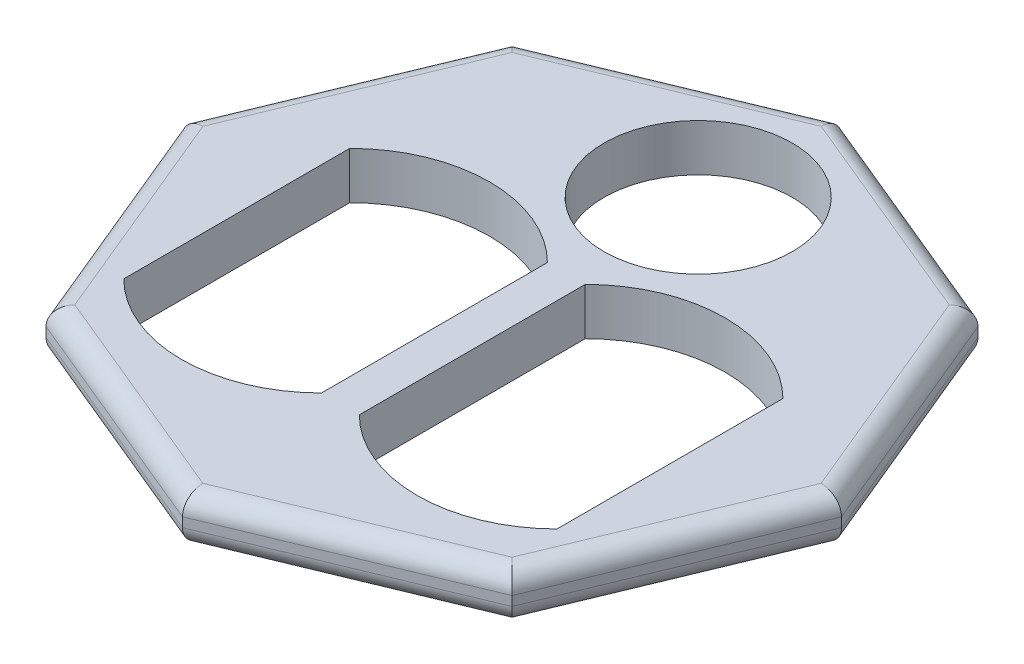
ISO-10303-21;
HEADER;
FILE_DESCRIPTION(('STEP AP214'),'2;1');
FILE_NAME('part.step','',(''),(''),'','','');
FILE_SCHEMA(('AUTOMOTIVE_DESIGN { 1 0 10303 214 1 1 1 1 }'));
ENDSEC;
DATA;
#1=APPLICATION_CONTEXT('core data for automotive mechanical design processes');
#2=APPLICATION_PROTOCOL_DEFINITION('international standard','automotive_design',2000,#1);
#3=PRODUCT_CONTEXT('',#1,'mechanical');
#4=PRODUCT('Part','Part','',(#3));
#5=PRODUCT_RELATED_PRODUCT_CATEGORY('part','',(#4));
#6=PRODUCT_DEFINITION_FORMATION('','',#4);
#7=PRODUCT_DEFINITION_CONTEXT('part definition',#1,'design');
#8=PRODUCT_DEFINITION('design','',#6,#7);
#9=PRODUCT_DEFINITION_SHAPE('','',#8);
#10=(LENGTH_UNIT() NAMED_UNIT(*) SI_UNIT(.MILLI.,.METRE.));
#11=(NAMED_UNIT(*) PLANE_ANGLE_UNIT() SI_UNIT($,.RADIAN.));
#12=(NAMED_UNIT(*) SI_UNIT($,.STERADIAN.) SOLID_ANGLE_UNIT());
#13=UNCERTAINTY_MEASURE_WITH_UNIT(LENGTH_MEASURE(1.E-05),#10,'distance_accuracy_value','');
#14=(GEOMETRIC_REPRESENTATION_CONTEXT(3) GLOBAL_UNCERTAINTY_ASSIGNED_CONTEXT((#13)) GLOBAL_UNIT_ASSIGNED_CONTEXT((#10,
#11,#12)) REPRESENTATION_CONTEXT('',''));
#15=CARTESIAN_POINT('',(0.,0.,0.));
#16=DIRECTION('',(0.,0.,1.));
#17=DIRECTION('',(1.,0.,0.));
#18=AXIS2_PLACEMENT_3D('',#15,#16,#17);
#19=CARTESIAN_POINT('',(0.,5.,0.));
#20=DIRECTION('',(0.,1.,0.));
#21=DIRECTION('',(0.,0.,1.));
#22=AXIS2_PLACEMENT_3D('',#19,#20,#21);
#23=PLANE('',#22);
#24=DIRECTION('',(0.382683432365079,0.,0.923879532511291));
#25=VECTOR('',#24,1.);
#26=CARTESIAN_POINT('',(22.9009782765069,5.,-23.9833704767987));
#27=LINE('',#26,#25);
#28=CARTESIAN_POINT('',(32.8352155994152,5.,3.77901634444324E-13));
#29=VERTEX_POINT('',#28);
#30=CARTESIAN_POINT('',(23.2180036120691,5.,-23.2180036120685));
#31=VERTEX_POINT('',#30);
#32=EDGE_CURVE('E327',#29,#31,#27,.F.);
#33=ORIENTED_EDGE('',*,*,#32,.T.);
#34=DIRECTION('',(0.923879532511282,0.,0.3826834323651));
#35=VECTOR('',#34,1.);
#36=CARTESIAN_POINT('',(-0.765366864729747,5.,-33.1522409349774));
#37=LINE('',#36,#35);
#38=CARTESIAN_POINT('',(0.,5.,-32.8352155994154));
#39=VERTEX_POINT('',#38);
#40=EDGE_CURVE('E329',#31,#39,#37,.F.);
#41=ORIENTED_EDGE('',*,*,#40,.T.);
#42=DIRECTION('',(-0.923879532511282,0.,0.3826834323651));
#43=VECTOR('',#42,1.);
#44=CARTESIAN_POINT('',(-23.9833704767993,5.,-22.9009782765063));
#45=LINE('',#44,#43);
#46=CARTESIAN_POINT('',(-23.2180036120691,5.,-23.2180036120685));
#47=VERTEX_POINT('',#46);
#48=EDGE_CURVE('E315',#39,#47,#45,.T.);
#49=ORIENTED_EDGE('',*,*,#48,.T.);
#50=DIRECTION('',(-0.382683432365079,0.,0.923879532511291));
#51=VECTOR('',#50,1.);
#52=CARTESIAN_POINT('',(-33.1522409349774,5.,0.765366864730565));
#53=LINE('',#52,#51);
#54=CARTESIAN_POINT('',(-32.8352155994152,5.,3.74318697810929E-13));
#55=VERTEX_POINT('',#54);
#56=EDGE_CURVE('E317',#47,#55,#53,.T.);
#57=ORIENTED_EDGE('',*,*,#56,.T.);
#58=DIRECTION('',(0.3826834323651,0.,0.923879532511283));
#59=VECTOR('',#58,1.);
#60=CARTESIAN_POINT('',(-22.9009782765063,5.,23.9833704767993));
#61=LINE('',#60,#59);
#62=CARTESIAN_POINT('',(-23.2180036120685,5.,23.2180036120691));
#63=VERTEX_POINT('',#62);
#64=EDGE_CURVE('E319',#55,#63,#61,.T.);
#65=ORIENTED_EDGE('',*,*,#64,.T.);
#66=DIRECTION('',(0.923879532511291,0.,0.382683432365079));
#67=VECTOR('',#66,1.);
#68=CARTESIAN_POINT('',(0.765366864729876,5.,33.1522409349771));
#69=LINE('',#68,#67);
#70=CARTESIAN_POINT('',(0.,5.,32.8352155994151));
#71=VERTEX_POINT('',#70);
#72=EDGE_CURVE('E321',#63,#71,#69,.T.);
#73=ORIENTED_EDGE('',*,*,#72,.T.);
#74=DIRECTION('',(-0.923879532511291,0.,0.382683432365079));
#75=VECTOR('',#74,1.);
#76=CARTESIAN_POINT('',(23.9833704767987,5.,22.9009782765069));
#77=LINE('',#76,#75);
#78=CARTESIAN_POINT('',(23.2180036120685,5.,23.2180036120691));
#79=VERTEX_POINT('',#78);
#80=EDGE_CURVE('E323',#71,#79,#77,.F.);
#81=ORIENTED_EDGE('',*,*,#80,.T.);
#82=DIRECTION('',(-0.3826834323651,0.,0.923879532511283));
#83=VECTOR('',#82,1.);
#84=CARTESIAN_POINT('',(33.1522409349774,5.,-0.765366864729796));
#85=LINE('',#84,#83);
#86=EDGE_CURVE('E325',#79,#29,#85,.F.);
#87=ORIENTED_EDGE('',*,*,#86,.T.);
#88=EDGE_LOOP('',(#33,#41,#49,#57,#65,#73,#81,#87));
#89=FACE_BOUND('',#88,.T.);
#90=CARTESIAN_POINT('',(0.,5.,-19.772592195674));
#91=DIRECTION('',(0.,1.,0.));
#92=DIRECTION('',(0.,0.,1.));
#93=AXIS2_PLACEMENT_3D('',#90,#91,#92);
#94=CIRCLE('',#93,10.);
#95=CARTESIAN_POINT('',(0.,5.,-9.772592195674));
#96=VERTEX_POINT('',#95);
#97=EDGE_CURVE('E378',#96,#96,#94,.T.);
#98=ORIENTED_EDGE('',*,*,#97,.F.);
#99=EDGE_LOOP('',(#98));
#100=FACE_BOUND('',#99,.T.);
#101=CARTESIAN_POINT('',(-12.50862263104,5.,7.72917563336113));
#102=DIRECTION('',(0.,1.,0.));
#103=DIRECTION('',(0.,0.,1.));
#104=AXIS2_PLACEMENT_3D('',#101,#102,#103);
#105=CIRCLE('',#104,14.8492424049175);
#106=CARTESIAN_POINT('',(-23.00862263104,5.,18.2291756333611));
#107=VERTEX_POINT('',#106);
#108=CARTESIAN_POINT('',(-2.00862263103995,5.,18.2291756333611));
#109=VERTEX_POINT('',#108);
#110=EDGE_CURVE('E247',#107,#109,#105,.T.);
#111=ORIENTED_EDGE('',*,*,#110,.F.);
#112=DIRECTION('',(0.,0.,1.));
#113=VECTOR('',#112,1.);
#114=CARTESIAN_POINT('',(-23.00862263104,5.,-5.77082436663888));
#115=LINE('',#114,#113);
#116=CARTESIAN_POINT('',(-23.00862263104,5.,-5.77082436663888));
#117=VERTEX_POINT('',#116);
#118=EDGE_CURVE('E262',#117,#107,#115,.T.);
#119=ORIENTED_EDGE('',*,*,#118,.F.);
#120=CARTESIAN_POINT('',(-12.50862263104,5.,4.72917563336111));
#121=DIRECTION('',(0.,1.,0.));
#122=DIRECTION('',(0.,0.,1.));
#123=AXIS2_PLACEMENT_3D('',#120,#121,#122);
#124=CIRCLE('',#123,14.8492424049175);
#125=CARTESIAN_POINT('',(-2.00862263103995,5.,-5.77082436663888));
#126=VERTEX_POINT('',#125);
#127=EDGE_CURVE('E251',#117,#126,#124,.F.);
#128=ORIENTED_EDGE('',*,*,#127,.T.);
#129=DIRECTION('',(0.,0.,1.));
#130=VECTOR('',#129,1.);
#131=CARTESIAN_POINT('',(-2.00862263103995,5.,-5.77082436663888));
#132=LINE('',#131,#130);
#133=EDGE_CURVE('E255',#126,#109,#132,.T.);
#134=ORIENTED_EDGE('',*,*,#133,.T.);
#135=EDGE_LOOP('',(#111,#119,#128,#134));
#136=FACE_BOUND('',#135,.T.);
#137=CARTESIAN_POINT('',(12.50862263104,5.,7.72917563336113));
#138=DIRECTION('',(0.,-1.,0.));
#139=DIRECTION('',(0.,0.,1.));
#140=AXIS2_PLACEMENT_3D('',#137,#138,#139);
#141=CIRCLE('',#140,14.8492424049175);
#142=CARTESIAN_POINT('',(23.00862263104,5.,18.2291756333611));
#143=VERTEX_POINT('',#142);
#144=CARTESIAN_POINT('',(2.00862263103995,5.,18.2291756333611));
#145=VERTEX_POINT('',#144);
#146=EDGE_CURVE('E211',#143,#145,#141,.T.);
#147=ORIENTED_EDGE('',*,*,#146,.T.);
#148=DIRECTION('',(0.,0.,1.));
#149=VECTOR('',#148,1.);
#150=CARTESIAN_POINT('',(2.00862263103995,5.,-5.77082436663888));
#151=LINE('',#150,#149);
#152=CARTESIAN_POINT('',(2.00862263103995,5.,-5.77082436663888));
#153=VERTEX_POINT('',#152);
#154=EDGE_CURVE('E227',#153,#145,#151,.T.);
#155=ORIENTED_EDGE('',*,*,#154,.F.);
#156=CARTESIAN_POINT('',(12.50862263104,5.,4.72917563336111));
#157=DIRECTION('',(0.,-1.,0.));
#158=DIRECTION('',(0.,0.,1.));
#159=AXIS2_PLACEMENT_3D('',#156,#157,#158);
#160=CIRCLE('',#159,14.8492424049175);
#161=CARTESIAN_POINT('',(23.00862263104,5.,-5.77082436663888));
#162=VERTEX_POINT('',#161);
#163=EDGE_CURVE('E213',#162,#153,#160,.F.);
#164=ORIENTED_EDGE('',*,*,#163,.F.);
#165=DIRECTION('',(0.,0.,1.));
#166=VECTOR('',#165,1.);
#167=CARTESIAN_POINT('',(23.00862263104,5.,-5.77082436663888));
#168=LINE('',#167,#166);
#169=EDGE_CURVE('E199',#162,#143,#168,.T.);
#170=ORIENTED_EDGE('',*,*,#169,.T.);
#171=EDGE_LOOP('',(#147,#155,#164,#170));
#172=FACE_BOUND('',#171,.T.);
#173=ADVANCED_FACE('F33',(#89,#100,#136,#172),#23,.T.);
#174=CARTESIAN_POINT('',(0.,0.,0.));
#175=DIRECTION('',(0.,1.,0.));
#176=DIRECTION('',(0.,0.,1.));
#177=AXIS2_PLACEMENT_3D('',#174,#175,#176);
#178=PLANE('',#177);
#179=DIRECTION('',(-0.923879532511282,0.,0.3826834323651));
#180=VECTOR('',#179,1.);
#181=CARTESIAN_POINT('',(-11.6090018060347,0.,-28.0266096057419));
#182=LINE('',#181,#180);
#183=CARTESIAN_POINT('',(-23.2180036120691,0.,-23.2180036120685));
#184=VERTEX_POINT('',#183);
#185=CARTESIAN_POINT('',(0.,0.,-32.8352155994154));
#186=VERTEX_POINT('',#185);
#187=EDGE_CURVE('E292',#184,#186,#182,.F.);
#188=ORIENTED_EDGE('',*,*,#187,.T.);
#189=DIRECTION('',(0.923879532511282,0.,0.3826834323651));
#190=VECTOR('',#189,1.);
#191=CARTESIAN_POINT('',(11.6090018060347,0.,-28.0266096057419));
#192=LINE('',#191,#190);
#193=CARTESIAN_POINT('',(23.2180036120691,0.,-23.2180036120685));
#194=VERTEX_POINT('',#193);
#195=EDGE_CURVE('E306',#186,#194,#192,.T.);
#196=ORIENTED_EDGE('',*,*,#195,.T.);
#197=DIRECTION('',(0.382683432365079,0.,0.923879532511291));
#198=VECTOR('',#197,1.);
#199=CARTESIAN_POINT('',(28.0266096057421,0.,-11.6090018060341));
#200=LINE('',#199,#198);
#201=CARTESIAN_POINT('',(32.8352155994152,0.,3.74318697810929E-13));
#202=VERTEX_POINT('',#201);
#203=EDGE_CURVE('E304',#194,#202,#200,.T.);
#204=ORIENTED_EDGE('',*,*,#203,.T.);
#205=DIRECTION('',(-0.3826834323651,0.,0.923879532511283));
#206=VECTOR('',#205,1.);
#207=CARTESIAN_POINT('',(28.0266096057419,0.,11.6090018060347));
#208=LINE('',#207,#206);
#209=CARTESIAN_POINT('',(23.2180036120685,0.,23.2180036120691));
#210=VERTEX_POINT('',#209);
#211=EDGE_CURVE('E302',#202,#210,#208,.T.);
#212=ORIENTED_EDGE('',*,*,#211,.T.);
#213=DIRECTION('',(-0.923879532511291,0.,0.382683432365079));
#214=VECTOR('',#213,1.);
#215=CARTESIAN_POINT('',(11.6090018060341,0.,28.0266096057421));
#216=LINE('',#215,#214);
#217=CARTESIAN_POINT('',(0.,0.,32.8352155994151));
#218=VERTEX_POINT('',#217);
#219=EDGE_CURVE('E300',#210,#218,#216,.T.);
#220=ORIENTED_EDGE('',*,*,#219,.T.);
#221=DIRECTION('',(0.923879532511291,0.,0.382683432365079));
#222=VECTOR('',#221,1.);
#223=CARTESIAN_POINT('',(-11.6090018060341,0.,28.0266096057421));
#224=LINE('',#223,#222);
#225=CARTESIAN_POINT('',(-23.2180036120685,0.,23.2180036120691));
#226=VERTEX_POINT('',#225);
#227=EDGE_CURVE('E298',#218,#226,#224,.F.);
#228=ORIENTED_EDGE('',*,*,#227,.T.);
#229=DIRECTION('',(0.3826834323651,0.,0.923879532511283));
#230=VECTOR('',#229,1.);
#231=CARTESIAN_POINT('',(-28.0266096057419,0.,11.6090018060347));
#232=LINE('',#231,#230);
#233=CARTESIAN_POINT('',(-32.8352155994152,0.,3.77901634444324E-13));
#234=VERTEX_POINT('',#233);
#235=EDGE_CURVE('E296',#226,#234,#232,.F.);
#236=ORIENTED_EDGE('',*,*,#235,.T.);
#237=DIRECTION('',(-0.382683432365079,0.,0.923879532511291));
#238=VECTOR('',#237,1.);
#239=CARTESIAN_POINT('',(-28.0266096057421,0.,-11.6090018060341));
#240=LINE('',#239,#238);
#241=EDGE_CURVE('E294',#234,#184,#240,.F.);
#242=ORIENTED_EDGE('',*,*,#241,.T.);
#243=EDGE_LOOP('',(#188,#196,#204,#212,#220,#228,#236,#242));
#244=FACE_BOUND('',#243,.T.);
#245=CARTESIAN_POINT('',(0.,0.,-19.772592195674));
#246=DIRECTION('',(0.,1.,0.));
#247=DIRECTION('',(0.,0.,1.));
#248=AXIS2_PLACEMENT_3D('',#245,#246,#247);
#249=CIRCLE('',#248,10.);
#250=CARTESIAN_POINT('',(0.,0.,-9.772592195674));
#251=VERTEX_POINT('',#250);
#252=EDGE_CURVE('E214',#251,#251,#249,.T.);
#253=ORIENTED_EDGE('',*,*,#252,.T.);
#254=EDGE_LOOP('',(#253));
#255=FACE_BOUND('',#254,.T.);
#256=DIRECTION('',(0.,0.,1.));
#257=VECTOR('',#256,1.);
#258=CARTESIAN_POINT('',(-23.00862263104,0.,-5.77082436663888));
#259=LINE('',#258,#257);
#260=CARTESIAN_POINT('',(-23.00862263104,0.,-5.77082436663888));
#261=VERTEX_POINT('',#260);
#262=CARTESIAN_POINT('',(-23.00862263104,0.,18.2291756333611));
#263=VERTEX_POINT('',#262);
#264=EDGE_CURVE('E261',#261,#263,#259,.T.);
#265=ORIENTED_EDGE('',*,*,#264,.T.);
#266=CARTESIAN_POINT('',(-12.50862263104,0.,7.72917563336113));
#267=DIRECTION('',(0.,1.,0.));
#268=DIRECTION('',(0.,0.,1.));
#269=AXIS2_PLACEMENT_3D('',#266,#267,#268);
#270=CIRCLE('',#269,14.8492424049175);
#271=CARTESIAN_POINT('',(-2.00862263103995,0.,18.2291756333611));
#272=VERTEX_POINT('',#271);
#273=EDGE_CURVE('E248',#263,#272,#270,.T.);
#274=ORIENTED_EDGE('',*,*,#273,.T.);
#275=DIRECTION('',(0.,0.,1.));
#276=VECTOR('',#275,1.);
#277=CARTESIAN_POINT('',(-2.00862263103995,0.,-5.77082436663888));
#278=LINE('',#277,#276);
#279=CARTESIAN_POINT('',(-2.00862263103995,0.,-5.77082436663888));
#280=VERTEX_POINT('',#279);
#281=EDGE_CURVE('E258',#280,#272,#278,.T.);
#282=ORIENTED_EDGE('',*,*,#281,.F.);
#283=CARTESIAN_POINT('',(-12.50862263104,0.,4.72917563336111));
#284=DIRECTION('',(0.,1.,0.));
#285=DIRECTION('',(0.,0.,1.));
#286=AXIS2_PLACEMENT_3D('',#283,#284,#285);
#287=CIRCLE('',#286,14.8492424049175);
#288=EDGE_CURVE('E253',#261,#280,#287,.F.);
#289=ORIENTED_EDGE('',*,*,#288,.F.);
#290=EDGE_LOOP('',(#265,#274,#282,#289));
#291=FACE_BOUND('',#290,.T.);
#292=DIRECTION('',(0.,0.,1.));
#293=VECTOR('',#292,1.);
#294=CARTESIAN_POINT('',(23.00862263104,0.,-5.77082436663888));
#295=LINE('',#294,#293);
#296=CARTESIAN_POINT('',(23.00862263104,0.,-5.77082436663888));
#297=VERTEX_POINT('',#296);
#298=CARTESIAN_POINT('',(23.00862263104,0.,18.2291756333611));
#299=VERTEX_POINT('',#298);
#300=EDGE_CURVE('E202',#297,#299,#295,.T.);
#301=ORIENTED_EDGE('',*,*,#300,.F.);
#302=CARTESIAN_POINT('',(12.50862263104,0.,4.72917563336111));
#303=DIRECTION('',(0.,-1.,0.));
#304=DIRECTION('',(0.,0.,1.));
#305=AXIS2_PLACEMENT_3D('',#302,#303,#304);
#306=CIRCLE('',#305,14.8492424049175);
#307=CARTESIAN_POINT('',(2.00862263103995,0.,-5.77082436663888));
#308=VERTEX_POINT('',#307);
#309=EDGE_CURVE('E235',#297,#308,#306,.F.);
#310=ORIENTED_EDGE('',*,*,#309,.T.);
#311=DIRECTION('',(0.,0.,1.));
#312=VECTOR('',#311,1.);
#313=CARTESIAN_POINT('',(2.00862263103995,0.,-5.77082436663888));
#314=LINE('',#313,#312);
#315=CARTESIAN_POINT('',(2.00862263103995,0.,18.2291756333611));
#316=VERTEX_POINT('',#315);
#317=EDGE_CURVE('E231',#308,#316,#314,.T.);
#318=ORIENTED_EDGE('',*,*,#317,.T.);
#319=CARTESIAN_POINT('',(12.50862263104,0.,7.72917563336113));
#320=DIRECTION('',(0.,-1.,0.));
#321=DIRECTION('',(0.,0.,1.));
#322=AXIS2_PLACEMENT_3D('',#319,#320,#321);
#323=CIRCLE('',#322,14.8492424049175);
#324=EDGE_CURVE('E221',#299,#316,#323,.T.);
#325=ORIENTED_EDGE('',*,*,#324,.F.);
#326=EDGE_LOOP('',(#301,#310,#318,#325));
#327=FACE_BOUND('',#326,.T.);
#328=ADVANCED_FACE('F441',(#244,#255,#291,#327),#178,.F.);
#329=CARTESIAN_POINT('',(-4.09613743632685E-13,5.,-35.));
#330=DIRECTION('',(0.3826834323651,0.,0.923879532511282));
#331=DIRECTION('',(0.923879532511282,0.,-0.3826834323651));
#332=AXIS2_PLACEMENT_3D('',#329,#330,#331);
#333=PLANE('',#332);
#334=DIRECTION('',(0.,-1.,0.));
#335=VECTOR('',#334,1.);
#336=CARTESIAN_POINT('',(-4.09613743632685E-13,5.,-35.));
#337=LINE('',#336,#335);
#338=CARTESIAN_POINT('',(-4.09613743632685E-13,3.,-35.));
#339=VERTEX_POINT('',#338);
#340=CARTESIAN_POINT('',(-4.09613743632685E-13,2.,-35.));
#341=VERTEX_POINT('',#340);
#342=EDGE_CURVE('E290',#339,#341,#337,.T.);
#343=ORIENTED_EDGE('',*,*,#342,.T.);
#344=DIRECTION('',(-0.923879532511282,0.,0.3826834323651));
#345=VECTOR('',#344,1.);
#346=CARTESIAN_POINT('',(-4.09613743632685E-13,2.,-35.));
#347=LINE('',#346,#345);
#348=CARTESIAN_POINT('',(-24.7487373415295,2.,-24.7487373415289));
#349=VERTEX_POINT('',#348);
#350=EDGE_CURVE('E11',#341,#349,#347,.T.);
#351=ORIENTED_EDGE('',*,*,#350,.T.);
#352=DIRECTION('',(0.,-1.,0.));
#353=VECTOR('',#352,1.);
#354=CARTESIAN_POINT('',(-24.7487373415295,5.,-24.7487373415289));
#355=LINE('',#354,#353);
#356=CARTESIAN_POINT('',(-24.7487373415295,3.,-24.7487373415289));
#357=VERTEX_POINT('',#356);
#358=EDGE_CURVE('E288',#357,#349,#355,.T.);
#359=ORIENTED_EDGE('',*,*,#358,.F.);
#360=DIRECTION('',(-0.923879532511282,0.,0.3826834323651));
#361=VECTOR('',#360,1.);
#362=CARTESIAN_POINT('',(3.21790404531486E-13,3.,-35.0000000000003));
#363=LINE('',#362,#361);
#364=EDGE_CURVE('E42',#357,#339,#363,.F.);
#365=ORIENTED_EDGE('',*,*,#364,.T.);
#366=EDGE_LOOP('',(#343,#351,#359,#365));
#367=FACE_BOUND('',#366,.T.);
#368=ADVANCED_FACE('F424',(#367),#333,.F.);
#369=CARTESIAN_POINT('',(-24.7487373415295,5.,-24.7487373415289));
#370=DIRECTION('',(0.923879532511291,0.,0.382683432365079));
#371=DIRECTION('',(0.382683432365079,0.,-0.923879532511291));
#372=AXIS2_PLACEMENT_3D('',#369,#370,#371);
#373=PLANE('',#372);
#374=DIRECTION('',(0.,-1.,0.));
#375=VECTOR('',#374,1.);
#376=CARTESIAN_POINT('',(-35.,5.,4.05560917730401E-13));
#377=LINE('',#376,#375);
#378=CARTESIAN_POINT('',(-35.,3.,4.05560917730401E-13));
#379=VERTEX_POINT('',#378);
#380=CARTESIAN_POINT('',(-35.,2.,4.05560917730401E-13));
#381=VERTEX_POINT('',#380);
#382=EDGE_CURVE('E285',#379,#381,#377,.T.);
#383=ORIENTED_EDGE('',*,*,#382,.F.);
#384=DIRECTION('',(-0.382683432365079,0.,0.923879532511291));
#385=VECTOR('',#384,1.);
#386=CARTESIAN_POINT('',(-24.7487373415295,3.,-24.7487373415289));
#387=LINE('',#386,#385);
#388=EDGE_CURVE('E55',#379,#357,#387,.F.);
#389=ORIENTED_EDGE('',*,*,#388,.T.);
#390=ORIENTED_EDGE('',*,*,#358,.T.);
#391=DIRECTION('',(-0.382683432365079,0.,0.923879532511291));
#392=VECTOR('',#391,1.);
#393=CARTESIAN_POINT('',(-24.7487373415295,2.,-24.7487373415289));
#394=LINE('',#393,#392);
#395=EDGE_CURVE('E352',#349,#381,#394,.T.);
#396=ORIENTED_EDGE('',*,*,#395,.T.);
#397=EDGE_LOOP('',(#383,#389,#390,#396));
#398=FACE_BOUND('',#397,.T.);
#399=ADVANCED_FACE('F452',(#398),#373,.F.);
#400=CARTESIAN_POINT('',(-35.,5.,4.05560917730401E-13));
#401=DIRECTION('',(0.923879532511283,0.,-0.3826834323651));
#402=DIRECTION('',(-0.3826834323651,0.,-0.923879532511283));
#403=AXIS2_PLACEMENT_3D('',#400,#401,#402);
#404=PLANE('',#403);
#405=ORIENTED_EDGE('',*,*,#382,.T.);
#406=DIRECTION('',(0.3826834323651,0.,0.923879532511283));
#407=VECTOR('',#406,1.);
#408=CARTESIAN_POINT('',(-35.,2.,4.05560917730401E-13));
#409=LINE('',#408,#407);
#410=CARTESIAN_POINT('',(-24.7487373415289,2.,24.7487373415295));
#411=VERTEX_POINT('',#410);
#412=EDGE_CURVE('E350',#381,#411,#409,.T.);
#413=ORIENTED_EDGE('',*,*,#412,.T.);
#414=DIRECTION('',(0.,-1.,0.));
#415=VECTOR('',#414,1.);
#416=CARTESIAN_POINT('',(-24.7487373415289,5.,24.7487373415295));
#417=LINE('',#416,#415);
#418=CARTESIAN_POINT('',(-24.7487373415289,3.,24.7487373415295));
#419=VERTEX_POINT('',#418);
#420=EDGE_CURVE('E282',#419,#411,#417,.T.);
#421=ORIENTED_EDGE('',*,*,#420,.F.);
#422=DIRECTION('',(0.3826834323651,0.,0.923879532511283));
#423=VECTOR('',#422,1.);
#424=CARTESIAN_POINT('',(-35.,3.,4.04206167807603E-13));
#425=LINE('',#424,#423);
#426=EDGE_CURVE('E348',#419,#379,#425,.F.);
#427=ORIENTED_EDGE('',*,*,#426,.T.);
#428=EDGE_LOOP('',(#405,#413,#421,#427));
#429=FACE_BOUND('',#428,.T.);
#430=ADVANCED_FACE('F455',(#429),#404,.F.);
#431=CARTESIAN_POINT('',(-24.7487373415289,5.,24.7487373415295));
#432=DIRECTION('',(0.382683432365079,0.,-0.923879532511291));
#433=DIRECTION('',(-0.923879532511291,0.,-0.382683432365079));
#434=AXIS2_PLACEMENT_3D('',#431,#432,#433);
#435=PLANE('',#434);
#436=ORIENTED_EDGE('',*,*,#420,.T.);
#437=DIRECTION('',(0.923879532511291,0.,0.382683432365079));
#438=VECTOR('',#437,1.);
#439=CARTESIAN_POINT('',(-24.7487373415289,2.,24.7487373415295));
#440=LINE('',#439,#438);
#441=CARTESIAN_POINT('',(4.01359235477571E-13,2.,35.));
#442=VERTEX_POINT('',#441);
#443=EDGE_CURVE('E346',#411,#442,#440,.T.);
#444=ORIENTED_EDGE('',*,*,#443,.T.);
#445=DIRECTION('',(0.,-1.,0.));
#446=VECTOR('',#445,1.);
#447=CARTESIAN_POINT('',(4.01359235477571E-13,5.,35.));
#448=LINE('',#447,#446);
#449=CARTESIAN_POINT('',(4.01359235477571E-13,3.,35.));
#450=VERTEX_POINT('',#449);
#451=EDGE_CURVE('E279',#450,#442,#448,.T.);
#452=ORIENTED_EDGE('',*,*,#451,.F.);
#453=DIRECTION('',(0.923879532511291,0.,0.382683432365079));
#454=VECTOR('',#453,1.);
#455=CARTESIAN_POINT('',(-24.7487373415289,3.,24.7487373415295));
#456=LINE('',#455,#454);
#457=EDGE_CURVE('E344',#450,#419,#456,.F.);
#458=ORIENTED_EDGE('',*,*,#457,.T.);
#459=EDGE_LOOP('',(#436,#444,#452,#458));
#460=FACE_BOUND('',#459,.T.);
#461=ADVANCED_FACE('F469',(#460),#435,.F.);
#462=CARTESIAN_POINT('',(-2.00862263103995,0.,-5.77082436663888));
#463=DIRECTION('',(-1.,0.,0.));
#464=DIRECTION('',(0.,0.,1.));
#465=AXIS2_PLACEMENT_3D('',#462,#463,#464);
#466=PLANE('',#465);
#467=ORIENTED_EDGE('',*,*,#133,.F.);
#468=DIRECTION('',(0.,1.,0.));
#469=VECTOR('',#468,1.);
#470=CARTESIAN_POINT('',(-2.00862263103995,0.,-5.77082436663888));
#471=LINE('',#470,#469);
#472=EDGE_CURVE('E277',#280,#126,#471,.T.);
#473=ORIENTED_EDGE('',*,*,#472,.F.);
#474=ORIENTED_EDGE('',*,*,#281,.T.);
#475=DIRECTION('',(0.,1.,0.));
#476=VECTOR('',#475,1.);
#477=CARTESIAN_POINT('',(-2.00862263103995,0.,18.2291756333611));
#478=LINE('',#477,#476);
#479=EDGE_CURVE('E274',#272,#109,#478,.T.);
#480=ORIENTED_EDGE('',*,*,#479,.T.);
#481=EDGE_LOOP('',(#467,#473,#474,#480));
#482=FACE_BOUND('',#481,.T.);
#483=ADVANCED_FACE('F514',(#482),#466,.T.);
#484=CARTESIAN_POINT('',(-23.00862263104,0.,-5.77082436663888));
#485=DIRECTION('',(-1.,0.,0.));
#486=DIRECTION('',(0.,0.,1.));
#487=AXIS2_PLACEMENT_3D('',#484,#485,#486);
#488=PLANE('',#487);
#489=ORIENTED_EDGE('',*,*,#118,.T.);
#490=DIRECTION('',(0.,1.,0.));
#491=VECTOR('',#490,1.);
#492=CARTESIAN_POINT('',(-23.00862263104,0.,18.2291756333611));
#493=LINE('',#492,#491);
#494=EDGE_CURVE('E272',#263,#107,#493,.T.);
#495=ORIENTED_EDGE('',*,*,#494,.F.);
#496=ORIENTED_EDGE('',*,*,#264,.F.);
#497=DIRECTION('',(0.,1.,0.));
#498=VECTOR('',#497,1.);
#499=CARTESIAN_POINT('',(-23.00862263104,0.,-5.77082436663888));
#500=LINE('',#499,#498);
#501=EDGE_CURVE('E265',#261,#117,#500,.T.);
#502=ORIENTED_EDGE('',*,*,#501,.T.);
#503=EDGE_LOOP('',(#489,#495,#496,#502));
#504=FACE_BOUND('',#503,.T.);
#505=ADVANCED_FACE('F726',(#504),#488,.F.);
#506=CARTESIAN_POINT('',(-12.50862263104,0.,4.72917563336111));
#507=DIRECTION('',(0.,1.,0.));
#508=DIRECTION('',(0.,0.,1.));
#509=AXIS2_PLACEMENT_3D('',#506,#507,#508);
#510=CYLINDRICAL_SURFACE('',#509,14.8492424049175);
#511=ORIENTED_EDGE('',*,*,#127,.F.);
#512=ORIENTED_EDGE('',*,*,#501,.F.);
#513=ORIENTED_EDGE('',*,*,#288,.T.);
#514=ORIENTED_EDGE('',*,*,#472,.T.);
#515=EDGE_LOOP('',(#511,#512,#513,#514));
#516=FACE_BOUND('',#515,.T.);
#517=ADVANCED_FACE('F717',(#516),#510,.F.);
#518=CARTESIAN_POINT('',(-12.50862263104,0.,7.72917563336113));
#519=DIRECTION('',(0.,1.,0.));
#520=DIRECTION('',(0.,0.,1.));
#521=AXIS2_PLACEMENT_3D('',#518,#519,#520);
#522=CYLINDRICAL_SURFACE('',#521,14.8492424049175);
#523=ORIENTED_EDGE('',*,*,#110,.T.);
#524=ORIENTED_EDGE('',*,*,#479,.F.);
#525=ORIENTED_EDGE('',*,*,#273,.F.);
#526=ORIENTED_EDGE('',*,*,#494,.T.);
#527=EDGE_LOOP('',(#523,#524,#525,#526));
#528=FACE_BOUND('',#527,.T.);
#529=ADVANCED_FACE('F709',(#528),#522,.F.);
#530=CARTESIAN_POINT('',(4.09613743632685E-13,5.,-35.));
#531=DIRECTION('',(-0.3826834323651,0.,0.923879532511282));
#532=DIRECTION('',(-0.923879532511282,0.,-0.3826834323651));
#533=AXIS2_PLACEMENT_3D('',#530,#531,#532);
#534=PLANE('',#533);
#535=DIRECTION('',(0.,-1.,0.));
#536=VECTOR('',#535,1.);
#537=CARTESIAN_POINT('',(24.7487373415295,5.,-24.7487373415289));
#538=LINE('',#537,#536);
#539=CARTESIAN_POINT('',(24.7487373415295,3.,-24.7487373415289));
#540=VERTEX_POINT('',#539);
#541=CARTESIAN_POINT('',(24.7487373415295,2.,-24.7487373415289));
#542=VERTEX_POINT('',#541);
#543=EDGE_CURVE('E244',#540,#542,#538,.T.);
#544=ORIENTED_EDGE('',*,*,#543,.T.);
#545=DIRECTION('',(0.923879532511282,0.,0.3826834323651));
#546=VECTOR('',#545,1.);
#547=CARTESIAN_POINT('',(4.09613743632685E-13,2.,-35.));
#548=LINE('',#547,#546);
#549=EDGE_CURVE('E312',#542,#341,#548,.F.);
#550=ORIENTED_EDGE('',*,*,#549,.T.);
#551=ORIENTED_EDGE('',*,*,#342,.F.);
#552=DIRECTION('',(0.923879532511282,0.,0.3826834323651));
#553=VECTOR('',#552,1.);
#554=CARTESIAN_POINT('',(24.7487373415295,3.,-24.7487373415289));
#555=LINE('',#554,#553);
#556=EDGE_CURVE('E309',#339,#540,#555,.T.);
#557=ORIENTED_EDGE('',*,*,#556,.T.);
#558=EDGE_LOOP('',(#544,#550,#551,#557));
#559=FACE_BOUND('',#558,.T.);
#560=ADVANCED_FACE('F426',(#559),#534,.F.);
#561=CARTESIAN_POINT('',(24.7487373415295,5.,-24.7487373415289));
#562=DIRECTION('',(-0.923879532511291,0.,0.382683432365079));
#563=DIRECTION('',(-0.382683432365079,0.,-0.923879532511291));
#564=AXIS2_PLACEMENT_3D('',#561,#562,#563);
#565=PLANE('',#564);
#566=DIRECTION('',(0.,-1.,0.));
#567=VECTOR('',#566,1.);
#568=CARTESIAN_POINT('',(35.,5.,4.05560917730401E-13));
#569=LINE('',#568,#567);
#570=CARTESIAN_POINT('',(35.,3.,4.05560917730401E-13));
#571=VERTEX_POINT('',#570);
#572=CARTESIAN_POINT('',(35.,2.,4.05560917730401E-13));
#573=VERTEX_POINT('',#572);
#574=EDGE_CURVE('E241',#571,#573,#569,.T.);
#575=ORIENTED_EDGE('',*,*,#574,.T.);
#576=DIRECTION('',(0.382683432365079,0.,0.923879532511291));
#577=VECTOR('',#576,1.);
#578=CARTESIAN_POINT('',(24.7487373415295,2.,-24.7487373415289));
#579=LINE('',#578,#577);
#580=EDGE_CURVE('E334',#573,#542,#579,.F.);
#581=ORIENTED_EDGE('',*,*,#580,.T.);
#582=ORIENTED_EDGE('',*,*,#543,.F.);
#583=DIRECTION('',(0.382683432365079,0.,0.923879532511291));
#584=VECTOR('',#583,1.);
#585=CARTESIAN_POINT('',(35.,3.,4.07443176420053E-13));
#586=LINE('',#585,#584);
#587=EDGE_CURVE('E332',#540,#571,#586,.T.);
#588=ORIENTED_EDGE('',*,*,#587,.T.);
#589=EDGE_LOOP('',(#575,#581,#582,#588));
#590=FACE_BOUND('',#589,.T.);
#591=ADVANCED_FACE('F489',(#590),#565,.F.);
#592=CARTESIAN_POINT('',(35.,5.,4.05560917730401E-13));
#593=DIRECTION('',(-0.923879532511283,0.,-0.3826834323651));
#594=DIRECTION('',(0.3826834323651,0.,-0.923879532511283));
#595=AXIS2_PLACEMENT_3D('',#592,#593,#594);
#596=PLANE('',#595);
#597=DIRECTION('',(0.,-1.,0.));
#598=VECTOR('',#597,1.);
#599=CARTESIAN_POINT('',(24.7487373415289,5.,24.7487373415295));
#600=LINE('',#599,#598);
#601=CARTESIAN_POINT('',(24.7487373415289,3.,24.7487373415295));
#602=VERTEX_POINT('',#601);
#603=CARTESIAN_POINT('',(24.7487373415289,2.,24.7487373415295));
#604=VERTEX_POINT('',#603);
#605=EDGE_CURVE('E238',#602,#604,#600,.T.);
#606=ORIENTED_EDGE('',*,*,#605,.T.);
#607=DIRECTION('',(-0.3826834323651,0.,0.923879532511283));
#608=VECTOR('',#607,1.);
#609=CARTESIAN_POINT('',(35.,2.,4.05560917730401E-13));
#610=LINE('',#609,#608);
#611=EDGE_CURVE('E338',#604,#573,#610,.F.);
#612=ORIENTED_EDGE('',*,*,#611,.T.);
#613=ORIENTED_EDGE('',*,*,#574,.F.);
#614=DIRECTION('',(-0.3826834323651,0.,0.923879532511283));
#615=VECTOR('',#614,1.);
#616=CARTESIAN_POINT('',(24.7487373415289,3.,24.7487373415295));
#617=LINE('',#616,#615);
#618=EDGE_CURVE('E336',#571,#602,#617,.T.);
#619=ORIENTED_EDGE('',*,*,#618,.T.);
#620=EDGE_LOOP('',(#606,#612,#613,#619));
#621=FACE_BOUND('',#620,.T.);
#622=ADVANCED_FACE('F491',(#621),#596,.F.);
#623=CARTESIAN_POINT('',(24.7487373415289,5.,24.7487373415295));
#624=DIRECTION('',(-0.382683432365079,0.,-0.923879532511291));
#625=DIRECTION('',(0.923879532511291,0.,-0.382683432365079));
#626=AXIS2_PLACEMENT_3D('',#623,#624,#625);
#627=PLANE('',#626);
#628=ORIENTED_EDGE('',*,*,#451,.T.);
#629=DIRECTION('',(-0.923879532511291,0.,0.382683432365079));
#630=VECTOR('',#629,1.);
#631=CARTESIAN_POINT('',(24.7487373415289,2.,24.7487373415295));
#632=LINE('',#631,#630);
#633=EDGE_CURVE('E342',#442,#604,#632,.F.);
#634=ORIENTED_EDGE('',*,*,#633,.T.);
#635=ORIENTED_EDGE('',*,*,#605,.F.);
#636=DIRECTION('',(-0.923879532511291,0.,0.382683432365079));
#637=VECTOR('',#636,1.);
#638=CARTESIAN_POINT('',(-4.07334756202804E-13,3.,35.));
#639=LINE('',#638,#637);
#640=EDGE_CURVE('E340',#602,#450,#639,.T.);
#641=ORIENTED_EDGE('',*,*,#640,.T.);
#642=EDGE_LOOP('',(#628,#634,#635,#641));
#643=FACE_BOUND('',#642,.T.);
#644=ADVANCED_FACE('F471',(#643),#627,.F.);
#645=CARTESIAN_POINT('',(12.50862263104,0.,4.72917563336111));
#646=DIRECTION('',(0.,1.,0.));
#647=DIRECTION('',(0.,0.,1.));
#648=AXIS2_PLACEMENT_3D('',#645,#646,#647);
#649=CYLINDRICAL_SURFACE('',#648,14.8492424049175);
#650=ORIENTED_EDGE('',*,*,#163,.T.);
#651=DIRECTION('',(0.,1.,0.));
#652=VECTOR('',#651,1.);
#653=CARTESIAN_POINT('',(2.00862263103995,0.,-5.77082436663888));
#654=LINE('',#653,#652);
#655=EDGE_CURVE('E229',#308,#153,#654,.T.);
#656=ORIENTED_EDGE('',*,*,#655,.F.);
#657=ORIENTED_EDGE('',*,*,#309,.F.);
#658=DIRECTION('',(0.,1.,0.));
#659=VECTOR('',#658,1.);
#660=CARTESIAN_POINT('',(23.00862263104,0.,-5.77082436663888));
#661=LINE('',#660,#659);
#662=EDGE_CURVE('E219',#297,#162,#661,.T.);
#663=ORIENTED_EDGE('',*,*,#662,.T.);
#664=EDGE_LOOP('',(#650,#656,#657,#663));
#665=FACE_BOUND('',#664,.T.);
#666=ADVANCED_FACE('F671',(#665),#649,.F.);
#667=CARTESIAN_POINT('',(2.00862263103995,0.,-5.77082436663888));
#668=DIRECTION('',(1.,0.,0.));
#669=DIRECTION('',(0.,0.,1.));
#670=AXIS2_PLACEMENT_3D('',#667,#668,#669);
#671=PLANE('',#670);
#672=ORIENTED_EDGE('',*,*,#154,.T.);
#673=DIRECTION('',(0.,1.,0.));
#674=VECTOR('',#673,1.);
#675=CARTESIAN_POINT('',(2.00862263103995,0.,18.2291756333611));
#676=LINE('',#675,#674);
#677=EDGE_CURVE('E217',#316,#145,#676,.T.);
#678=ORIENTED_EDGE('',*,*,#677,.F.);
#679=ORIENTED_EDGE('',*,*,#317,.F.);
#680=ORIENTED_EDGE('',*,*,#655,.T.);
#681=EDGE_LOOP('',(#672,#678,#679,#680));
#682=FACE_BOUND('',#681,.T.);
#683=ADVANCED_FACE('F663',(#682),#671,.T.);
#684=CARTESIAN_POINT('',(12.50862263104,0.,7.72917563336113));
#685=DIRECTION('',(0.,1.,0.));
#686=DIRECTION('',(0.,0.,1.));
#687=AXIS2_PLACEMENT_3D('',#684,#685,#686);
#688=CYLINDRICAL_SURFACE('',#687,14.8492424049175);
#689=ORIENTED_EDGE('',*,*,#146,.F.);
#690=DIRECTION('',(0.,1.,0.));
#691=VECTOR('',#690,1.);
#692=CARTESIAN_POINT('',(23.00862263104,0.,18.2291756333611));
#693=LINE('',#692,#691);
#694=EDGE_CURVE('E196',#299,#143,#693,.T.);
#695=ORIENTED_EDGE('',*,*,#694,.F.);
#696=ORIENTED_EDGE('',*,*,#324,.T.);
#697=ORIENTED_EDGE('',*,*,#677,.T.);
#698=EDGE_LOOP('',(#689,#695,#696,#697));
#699=FACE_BOUND('',#698,.T.);
#700=ADVANCED_FACE('F216',(#699),#688,.F.);
#701=CARTESIAN_POINT('',(23.00862263104,0.,-5.77082436663888));
#702=DIRECTION('',(1.,0.,0.));
#703=DIRECTION('',(0.,0.,1.));
#704=AXIS2_PLACEMENT_3D('',#701,#702,#703);
#705=PLANE('',#704);
#706=ORIENTED_EDGE('',*,*,#169,.F.);
#707=ORIENTED_EDGE('',*,*,#662,.F.);
#708=ORIENTED_EDGE('',*,*,#300,.T.);
#709=ORIENTED_EDGE('',*,*,#694,.T.);
#710=EDGE_LOOP('',(#706,#707,#708,#709));
#711=FACE_BOUND('',#710,.T.);
#712=ADVANCED_FACE('F198',(#711),#705,.F.);
#713=CARTESIAN_POINT('',(0.,0.,-19.772592195674));
#714=DIRECTION('',(0.,1.,0.));
#715=DIRECTION('',(0.,0.,1.));
#716=AXIS2_PLACEMENT_3D('',#713,#714,#715);
#717=CYLINDRICAL_SURFACE('',#716,10.);
#718=ORIENTED_EDGE('',*,*,#252,.F.);
#719=EDGE_LOOP('',(#718));
#720=FACE_BOUND('',#719,.T.);
#721=ORIENTED_EDGE('',*,*,#97,.T.);
#722=EDGE_LOOP('',(#721));
#723=FACE_BOUND('',#722,.T.);
#724=ADVANCED_FACE('F639',(#720,#723),#717,.F.);
#725=CARTESIAN_POINT('',(-23.9833704767987,2.,22.9009782765069));
#726=DIRECTION('',(0.923879532511291,0.,0.382683432365079));
#727=DIRECTION('',(0.382683432365079,0.,-0.923879532511291));
#728=AXIS2_PLACEMENT_3D('',#725,#726,#727);
#729=CYLINDRICAL_SURFACE('',#728,2.);
#730=CARTESIAN_POINT('',(0.,2.,32.835215599415));
#731=DIRECTION('',(1.,0.,0.));
#732=DIRECTION('',(0.,0.,1.));
#733=AXIS2_PLACEMENT_3D('',#730,#731,#732);
#734=ELLIPSE('',#733,2.16478440058478,2.);
#735=EDGE_CURVE('E372',#442,#218,#734,.T.);
#736=ORIENTED_EDGE('',*,*,#735,.F.);
#737=ORIENTED_EDGE('',*,*,#443,.F.);
#738=CARTESIAN_POINT('',(-23.2180036120685,2.,23.2180036120691));
#739=DIRECTION('',(0.707106781186556,0.,0.707106781186539));
#740=DIRECTION('',(-0.707106781186539,0.,0.707106781186556));
#741=AXIS2_PLACEMENT_3D('',#738,#739,#740);
#742=ELLIPSE('',#741,2.16478440058479,2.);
#743=EDGE_CURVE('E375',#226,#411,#742,.F.);
#744=ORIENTED_EDGE('',*,*,#743,.F.);
#745=ORIENTED_EDGE('',*,*,#227,.F.);
#746=EDGE_LOOP('',(#736,#737,#744,#745));
#747=FACE_BOUND('',#746,.T.);
#748=ADVANCED_FACE('F465',(#747),#729,.T.);
#749=CARTESIAN_POINT('',(-33.1522409349774,2.,-0.765366864729795));
#750=DIRECTION('',(0.3826834323651,0.,0.923879532511283));
#751=DIRECTION('',(0.923879532511283,0.,-0.3826834323651));
#752=AXIS2_PLACEMENT_3D('',#749,#750,#751);
#753=CYLINDRICAL_SURFACE('',#752,2.);
#754=ORIENTED_EDGE('',*,*,#743,.T.);
#755=ORIENTED_EDGE('',*,*,#412,.F.);
#756=CARTESIAN_POINT('',(-32.8352155994152,2.,3.71881345162528E-13));
#757=DIRECTION('',(0.,0.,1.));
#758=DIRECTION('',(-1.,0.,0.));
#759=AXIS2_PLACEMENT_3D('',#756,#757,#758);
#760=ELLIPSE('',#759,2.16478440058479,2.);
#761=EDGE_CURVE('E369',#234,#381,#760,.F.);
#762=ORIENTED_EDGE('',*,*,#761,.F.);
#763=ORIENTED_EDGE('',*,*,#235,.F.);
#764=EDGE_LOOP('',(#754,#755,#762,#763));
#765=FACE_BOUND('',#764,.T.);
#766=ADVANCED_FACE('F458',(#765),#753,.T.);
#767=CARTESIAN_POINT('',(11.6090018060341,2.,28.0266096057421));
#768=DIRECTION('',(-0.923879532511291,0.,0.382683432365079));
#769=DIRECTION('',(0.382683432365079,0.,0.923879532511291));
#770=AXIS2_PLACEMENT_3D('',#767,#768,#769);
#771=CYLINDRICAL_SURFACE('',#770,2.);
#772=ORIENTED_EDGE('',*,*,#735,.T.);
#773=ORIENTED_EDGE('',*,*,#219,.F.);
#774=CARTESIAN_POINT('',(23.2180036120685,2.,23.2180036120691));
#775=DIRECTION('',(-0.707106781186556,0.,0.707106781186539));
#776=DIRECTION('',(-0.707106781186539,0.,-0.707106781186556));
#777=AXIS2_PLACEMENT_3D('',#774,#775,#776);
#778=ELLIPSE('',#777,2.16478440058479,2.);
#779=EDGE_CURVE('E366',#604,#210,#778,.F.);
#780=ORIENTED_EDGE('',*,*,#779,.F.);
#781=ORIENTED_EDGE('',*,*,#633,.F.);
#782=EDGE_LOOP('',(#772,#773,#780,#781));
#783=FACE_BOUND('',#782,.T.);
#784=ADVANCED_FACE('F498',(#783),#771,.T.);
#785=CARTESIAN_POINT('',(-22.9009782765069,2.,-23.9833704767987));
#786=DIRECTION('',(-0.382683432365079,0.,0.923879532511291));
#787=DIRECTION('',(0.923879532511291,0.,0.382683432365079));
#788=AXIS2_PLACEMENT_3D('',#785,#786,#787);
#789=CYLINDRICAL_SURFACE('',#788,2.);
#790=ORIENTED_EDGE('',*,*,#761,.T.);
#791=ORIENTED_EDGE('',*,*,#395,.F.);
#792=CARTESIAN_POINT('',(-23.2180036120691,2.,-23.2180036120685));
#793=DIRECTION('',(-0.707106781186539,0.,0.707106781186556));
#794=DIRECTION('',(-0.707106781186556,0.,-0.707106781186539));
#795=AXIS2_PLACEMENT_3D('',#792,#793,#794);
#796=ELLIPSE('',#795,2.16478440058479,2.);
#797=EDGE_CURVE('E363',#184,#349,#796,.F.);
#798=ORIENTED_EDGE('',*,*,#797,.F.);
#799=ORIENTED_EDGE('',*,*,#241,.F.);
#800=EDGE_LOOP('',(#790,#791,#798,#799));
#801=FACE_BOUND('',#800,.T.);
#802=ADVANCED_FACE('F450',(#801),#789,.T.);
#803=CARTESIAN_POINT('',(28.0266096057419,2.,11.6090018060347));
#804=DIRECTION('',(-0.3826834323651,0.,0.923879532511283));
#805=DIRECTION('',(0.923879532511283,0.,0.3826834323651));
#806=AXIS2_PLACEMENT_3D('',#803,#804,#805);
#807=CYLINDRICAL_SURFACE('',#806,2.);
#808=ORIENTED_EDGE('',*,*,#779,.T.);
#809=ORIENTED_EDGE('',*,*,#211,.F.);
#810=CARTESIAN_POINT('',(32.8352155994152,2.,3.84241249928863E-13));
#811=DIRECTION('',(0.,0.,1.));
#812=DIRECTION('',(-1.,0.,0.));
#813=AXIS2_PLACEMENT_3D('',#810,#811,#812);
#814=ELLIPSE('',#813,2.16478440058479,2.);
#815=EDGE_CURVE('E360',#573,#202,#814,.F.);
#816=ORIENTED_EDGE('',*,*,#815,.F.);
#817=ORIENTED_EDGE('',*,*,#611,.F.);
#818=EDGE_LOOP('',(#808,#809,#816,#817));
#819=FACE_BOUND('',#818,.T.);
#820=ADVANCED_FACE('F495',(#819),#807,.T.);
#821=CARTESIAN_POINT('',(0.765366864729791,2.,-33.1522409349774));
#822=DIRECTION('',(-0.923879532511282,0.,0.3826834323651));
#823=DIRECTION('',(0.3826834323651,0.,0.923879532511282));
#824=AXIS2_PLACEMENT_3D('',#821,#822,#823);
#825=CYLINDRICAL_SURFACE('',#824,2.);
#826=ORIENTED_EDGE('',*,*,#797,.T.);
#827=ORIENTED_EDGE('',*,*,#350,.F.);
#828=CARTESIAN_POINT('',(0.,2.,-32.8352155994154));
#829=DIRECTION('',(-1.,0.,0.));
#830=DIRECTION('',(0.,0.,1.));
#831=AXIS2_PLACEMENT_3D('',#828,#829,#830);
#832=ELLIPSE('',#831,2.1647844005848,2.);
#833=EDGE_CURVE('E358',#186,#341,#832,.F.);
#834=ORIENTED_EDGE('',*,*,#833,.F.);
#835=ORIENTED_EDGE('',*,*,#187,.F.);
#836=EDGE_LOOP('',(#826,#827,#834,#835));
#837=FACE_BOUND('',#836,.T.);
#838=ADVANCED_FACE('F447',(#837),#825,.T.);
#839=CARTESIAN_POINT('',(28.0266096057421,2.,-11.6090018060341));
#840=DIRECTION('',(0.382683432365079,0.,0.923879532511291));
#841=DIRECTION('',(0.923879532511291,0.,-0.382683432365079));
#842=AXIS2_PLACEMENT_3D('',#839,#840,#841);
#843=CYLINDRICAL_SURFACE('',#842,2.);
#844=ORIENTED_EDGE('',*,*,#815,.T.);
#845=ORIENTED_EDGE('',*,*,#203,.F.);
#846=CARTESIAN_POINT('',(23.2180036120691,2.,-23.2180036120685));
#847=DIRECTION('',(0.707106781186539,0.,0.707106781186556));
#848=DIRECTION('',(-0.707106781186556,0.,0.707106781186539));
#849=AXIS2_PLACEMENT_3D('',#846,#847,#848);
#850=ELLIPSE('',#849,2.16478440058479,2.);
#851=EDGE_CURVE('E356',#542,#194,#850,.F.);
#852=ORIENTED_EDGE('',*,*,#851,.F.);
#853=ORIENTED_EDGE('',*,*,#580,.F.);
#854=EDGE_LOOP('',(#844,#845,#852,#853));
#855=FACE_BOUND('',#854,.T.);
#856=ADVANCED_FACE('F437',(#855),#843,.T.);
#857=CARTESIAN_POINT('',(11.6090018060347,2.,-28.0266096057419));
#858=DIRECTION('',(0.923879532511282,0.,0.3826834323651));
#859=DIRECTION('',(0.3826834323651,0.,-0.923879532511282));
#860=AXIS2_PLACEMENT_3D('',#857,#858,#859);
#861=CYLINDRICAL_SURFACE('',#860,2.);
#862=ORIENTED_EDGE('',*,*,#833,.T.);
#863=ORIENTED_EDGE('',*,*,#549,.F.);
#864=ORIENTED_EDGE('',*,*,#851,.T.);
#865=ORIENTED_EDGE('',*,*,#195,.F.);
#866=EDGE_LOOP('',(#862,#863,#864,#865));
#867=FACE_BOUND('',#866,.T.);
#868=ADVANCED_FACE('F431',(#867),#861,.T.);
#869=CARTESIAN_POINT('',(-11.6090018060341,3.,28.0266096057421));
#870=DIRECTION('',(-0.923879532511291,0.,-0.382683432365079));
#871=DIRECTION('',(-0.382683432365079,0.,0.923879532511291));
#872=AXIS2_PLACEMENT_3D('',#869,#870,#871);
#873=CYLINDRICAL_SURFACE('',#872,2.);
#874=CARTESIAN_POINT('',(0.,3.,32.8352155994151));
#875=DIRECTION('',(-1.,0.,0.));
#876=DIRECTION('',(0.,0.,-1.));
#877=AXIS2_PLACEMENT_3D('',#874,#875,#876);
#878=ELLIPSE('',#877,2.16478440058478,2.);
#879=EDGE_CURVE('E394',#71,#450,#878,.F.);
#880=ORIENTED_EDGE('',*,*,#879,.F.);
#881=ORIENTED_EDGE('',*,*,#72,.F.);
#882=CARTESIAN_POINT('',(-23.2180036120685,3.,23.2180036120691));
#883=DIRECTION('',(-0.707106781186556,0.,-0.707106781186539));
#884=DIRECTION('',(0.707106781186539,0.,-0.707106781186556));
#885=AXIS2_PLACEMENT_3D('',#882,#883,#884);
#886=ELLIPSE('',#885,2.16478440058479,2.);
#887=EDGE_CURVE('E37',#419,#63,#886,.T.);
#888=ORIENTED_EDGE('',*,*,#887,.F.);
#889=ORIENTED_EDGE('',*,*,#457,.F.);
#890=EDGE_LOOP('',(#880,#881,#888,#889));
#891=FACE_BOUND('',#890,.T.);
#892=ADVANCED_FACE('F35',(#891),#873,.T.);
#893=CARTESIAN_POINT('',(-28.0266096057419,3.,11.6090018060347));
#894=DIRECTION('',(-0.3826834323651,0.,-0.923879532511283));
#895=DIRECTION('',(-0.923879532511283,0.,0.3826834323651));
#896=AXIS2_PLACEMENT_3D('',#893,#894,#895);
#897=CYLINDRICAL_SURFACE('',#896,2.);
#898=ORIENTED_EDGE('',*,*,#887,.T.);
#899=ORIENTED_EDGE('',*,*,#64,.F.);
#900=CARTESIAN_POINT('',(-32.8352155994152,3.,3.70363462121048E-13));
#901=DIRECTION('',(0.,0.,-1.));
#902=DIRECTION('',(1.,0.,0.));
#903=AXIS2_PLACEMENT_3D('',#900,#901,#902);
#904=ELLIPSE('',#903,2.16478440058479,2.);
#905=EDGE_CURVE('E392',#379,#55,#904,.T.);
#906=ORIENTED_EDGE('',*,*,#905,.F.);
#907=ORIENTED_EDGE('',*,*,#426,.F.);
#908=EDGE_LOOP('',(#898,#899,#906,#907));
#909=FACE_BOUND('',#908,.T.);
#910=ADVANCED_FACE('F405',(#909),#897,.T.);
#911=CARTESIAN_POINT('',(23.9833704767987,3.,22.9009782765069));
#912=DIRECTION('',(0.923879532511291,0.,-0.382683432365079));
#913=DIRECTION('',(-0.382683432365079,0.,-0.923879532511291));
#914=AXIS2_PLACEMENT_3D('',#911,#912,#913);
#915=CYLINDRICAL_SURFACE('',#914,2.);
#916=ORIENTED_EDGE('',*,*,#879,.T.);
#917=ORIENTED_EDGE('',*,*,#640,.F.);
#918=CARTESIAN_POINT('',(23.2180036120685,3.,23.2180036120691));
#919=DIRECTION('',(0.707106781186556,0.,-0.707106781186539));
#920=DIRECTION('',(0.707106781186539,0.,0.707106781186556));
#921=AXIS2_PLACEMENT_3D('',#918,#919,#920);
#922=ELLIPSE('',#921,2.16478440058479,2.);
#923=EDGE_CURVE('E389',#79,#602,#922,.T.);
#924=ORIENTED_EDGE('',*,*,#923,.F.);
#925=ORIENTED_EDGE('',*,*,#80,.F.);
#926=EDGE_LOOP('',(#916,#917,#924,#925));
#927=FACE_BOUND('',#926,.T.);
#928=ADVANCED_FACE('F473',(#927),#915,.T.);
#929=CARTESIAN_POINT('',(-28.0266096057421,3.,-11.6090018060341));
#930=DIRECTION('',(0.382683432365079,0.,-0.923879532511291));
#931=DIRECTION('',(-0.923879532511291,0.,-0.382683432365079));
#932=AXIS2_PLACEMENT_3D('',#929,#930,#931);
#933=CYLINDRICAL_SURFACE('',#932,2.);
#934=ORIENTED_EDGE('',*,*,#905,.T.);
#935=ORIENTED_EDGE('',*,*,#56,.F.);
#936=CARTESIAN_POINT('',(-23.2180036120691,3.,-23.2180036120685));
#937=DIRECTION('',(0.707106781186539,0.,-0.707106781186556));
#938=DIRECTION('',(0.707106781186556,0.,0.707106781186539));
#939=AXIS2_PLACEMENT_3D('',#936,#937,#938);
#940=ELLIPSE('',#939,2.16478440058479,2.);
#941=EDGE_CURVE('E386',#357,#47,#940,.T.);
#942=ORIENTED_EDGE('',*,*,#941,.F.);
#943=ORIENTED_EDGE('',*,*,#388,.F.);
#944=EDGE_LOOP('',(#934,#935,#942,#943));
#945=FACE_BOUND('',#944,.T.);
#946=ADVANCED_FACE('F417',(#945),#933,.T.);
#947=CARTESIAN_POINT('',(33.1522409349774,3.,-0.765366864729795));
#948=DIRECTION('',(0.3826834323651,0.,-0.923879532511283));
#949=DIRECTION('',(-0.923879532511283,0.,-0.3826834323651));
#950=AXIS2_PLACEMENT_3D('',#947,#948,#949);
#951=CYLINDRICAL_SURFACE('',#950,2.);
#952=ORIENTED_EDGE('',*,*,#923,.T.);
#953=ORIENTED_EDGE('',*,*,#618,.F.);
#954=CARTESIAN_POINT('',(32.8352155994152,3.,3.82669156778759E-13));
#955=DIRECTION('',(0.,0.,-1.));
#956=DIRECTION('',(1.,0.,0.));
#957=AXIS2_PLACEMENT_3D('',#954,#955,#956);
#958=ELLIPSE('',#957,2.16478440058479,2.);
#959=EDGE_CURVE('E383',#29,#571,#958,.T.);
#960=ORIENTED_EDGE('',*,*,#959,.F.);
#961=ORIENTED_EDGE('',*,*,#86,.F.);
#962=EDGE_LOOP('',(#952,#953,#960,#961));
#963=FACE_BOUND('',#962,.T.);
#964=ADVANCED_FACE('F477',(#963),#951,.T.);
#965=CARTESIAN_POINT('',(-11.6090018060347,3.,-28.0266096057419));
#966=DIRECTION('',(0.923879532511282,0.,-0.3826834323651));
#967=DIRECTION('',(-0.3826834323651,0.,-0.923879532511282));
#968=AXIS2_PLACEMENT_3D('',#965,#966,#967);
#969=CYLINDRICAL_SURFACE('',#968,2.);
#970=ORIENTED_EDGE('',*,*,#941,.T.);
#971=ORIENTED_EDGE('',*,*,#48,.F.);
#972=CARTESIAN_POINT('',(0.,3.,-32.8352155994154));
#973=DIRECTION('',(1.,0.,0.));
#974=DIRECTION('',(0.,0.,-1.));
#975=AXIS2_PLACEMENT_3D('',#972,#973,#974);
#976=ELLIPSE('',#975,2.1647844005848,2.);
#977=EDGE_CURVE('E381',#339,#39,#976,.T.);
#978=ORIENTED_EDGE('',*,*,#977,.F.);
#979=ORIENTED_EDGE('',*,*,#364,.F.);
#980=EDGE_LOOP('',(#970,#971,#978,#979));
#981=FACE_BOUND('',#980,.T.);
#982=ADVANCED_FACE('F420',(#981),#969,.T.);
#983=CARTESIAN_POINT('',(22.9009782765069,3.,-23.9833704767987));
#984=DIRECTION('',(-0.382683432365079,0.,-0.923879532511291));
#985=DIRECTION('',(-0.923879532511291,0.,0.382683432365079));
#986=AXIS2_PLACEMENT_3D('',#983,#984,#985);
#987=CYLINDRICAL_SURFACE('',#986,2.);
#988=ORIENTED_EDGE('',*,*,#959,.T.);
#989=ORIENTED_EDGE('',*,*,#587,.F.);
#990=CARTESIAN_POINT('',(23.2180036120691,3.,-23.2180036120685));
#991=DIRECTION('',(-0.707106781186539,0.,-0.707106781186556));
#992=DIRECTION('',(0.707106781186556,0.,-0.707106781186539));
#993=AXIS2_PLACEMENT_3D('',#990,#991,#992);
#994=ELLIPSE('',#993,2.16478440058479,2.);
#995=EDGE_CURVE('E379',#31,#540,#994,.T.);
#996=ORIENTED_EDGE('',*,*,#995,.F.);
#997=ORIENTED_EDGE('',*,*,#32,.F.);
#998=EDGE_LOOP('',(#988,#989,#996,#997));
#999=FACE_BOUND('',#998,.T.);
#1000=ADVANCED_FACE('F486',(#999),#987,.T.);
#1001=CARTESIAN_POINT('',(-0.765366864729791,3.,-33.1522409349774));
#1002=DIRECTION('',(-0.923879532511282,0.,-0.3826834323651));
#1003=DIRECTION('',(-0.3826834323651,0.,0.923879532511282));
#1004=AXIS2_PLACEMENT_3D('',#1001,#1002,#1003);
#1005=CYLINDRICAL_SURFACE('',#1004,2.);
#1006=ORIENTED_EDGE('',*,*,#977,.T.);
#1007=ORIENTED_EDGE('',*,*,#40,.F.);
#1008=ORIENTED_EDGE('',*,*,#995,.T.);
#1009=ORIENTED_EDGE('',*,*,#556,.F.);
#1010=EDGE_LOOP('',(#1006,#1007,#1008,#1009));
#1011=FACE_BOUND('',#1010,.T.);
#1012=ADVANCED_FACE('F484',(#1011),#1005,.T.);
#1013=CLOSED_SHELL('',(#173,#328,#368,#399,#430,#461,#483,#505,#517,#529,#560,#591,#622,#644,
#666,#683,#700,#712,#724,#748,#766,#784,#802,#820,#838,#856,#868,#892,#910,#928,#946,#964,#982,
#1000,#1012));
#1014=MANIFOLD_SOLID_BREP('B2',#1013);
#1015=ADVANCED_BREP_SHAPE_REPRESENTATION('',(#18,#1014),#14);
#1016=SHAPE_DEFINITION_REPRESENTATION(#9,#1015);
ENDSEC;
END-ISO-10303-21;
